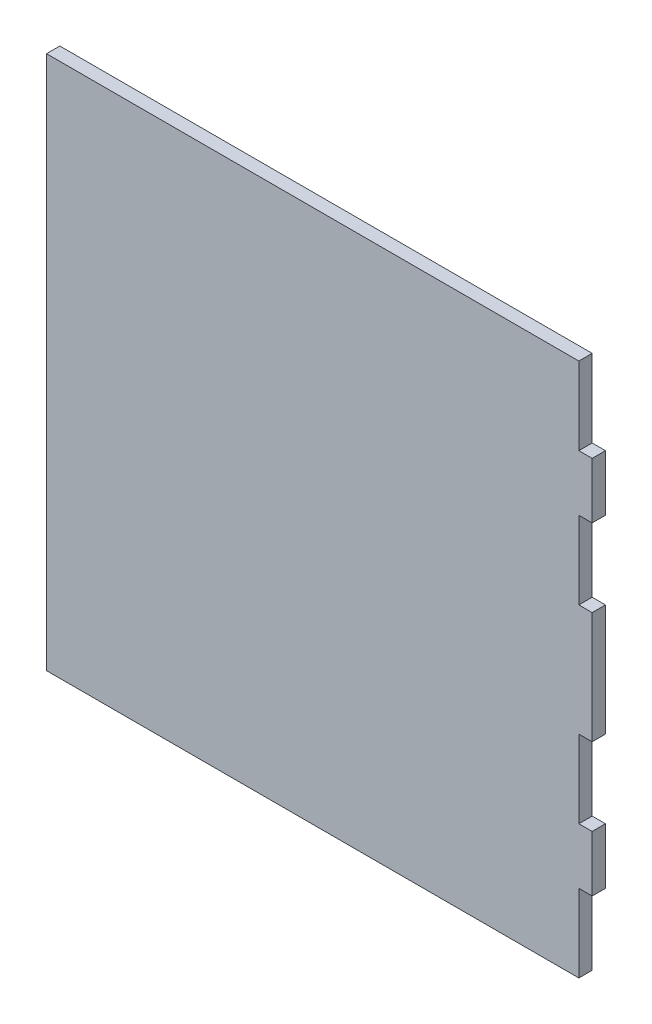
ISO-10303-21;
HEADER;
FILE_DESCRIPTION(('STEP AP214'),'2;1');
FILE_NAME('part.step','',(''),(''),'','','');
FILE_SCHEMA(('AUTOMOTIVE_DESIGN { 1 0 10303 214 1 1 1 1 }'));
ENDSEC;
DATA;
#1=APPLICATION_CONTEXT('core data for automotive mechanical design processes');
#2=APPLICATION_PROTOCOL_DEFINITION('international standard','automotive_design',2000,#1);
#3=PRODUCT_CONTEXT('',#1,'mechanical');
#4=PRODUCT('Part','Part','',(#3));
#5=PRODUCT_RELATED_PRODUCT_CATEGORY('part','',(#4));
#6=PRODUCT_DEFINITION_FORMATION('','',#4);
#7=PRODUCT_DEFINITION_CONTEXT('part definition',#1,'design');
#8=PRODUCT_DEFINITION('design','',#6,#7);
#9=PRODUCT_DEFINITION_SHAPE('','',#8);
#10=(LENGTH_UNIT() NAMED_UNIT(*) SI_UNIT(.MILLI.,.METRE.));
#11=(NAMED_UNIT(*) PLANE_ANGLE_UNIT() SI_UNIT($,.RADIAN.));
#12=(NAMED_UNIT(*) SI_UNIT($,.STERADIAN.) SOLID_ANGLE_UNIT());
#13=UNCERTAINTY_MEASURE_WITH_UNIT(LENGTH_MEASURE(1.E-05),#10,'distance_accuracy_value','');
#14=(GEOMETRIC_REPRESENTATION_CONTEXT(3) GLOBAL_UNCERTAINTY_ASSIGNED_CONTEXT((#13)) GLOBAL_UNIT_ASSIGNED_CONTEXT((#10,
#11,#12)) REPRESENTATION_CONTEXT('',''));
#15=CARTESIAN_POINT('',(0.,0.,0.));
#16=DIRECTION('',(0.,0.,1.));
#17=DIRECTION('',(1.,0.,0.));
#18=AXIS2_PLACEMENT_3D('',#15,#16,#17);
#19=CARTESIAN_POINT('',(-163.972610893126,-160.108528092475,6.));
#20=DIRECTION('',(-1.,0.,0.));
#21=DIRECTION('',(0.,0.,1.));
#22=AXIS2_PLACEMENT_3D('',#19,#20,#21);
#23=PLANE('',#22);
#24=DIRECTION('',(0.,1.,0.));
#25=VECTOR('',#24,1.);
#26=CARTESIAN_POINT('',(-163.972610893126,-160.108528092475,0.));
#27=LINE('',#26,#25);
#28=CARTESIAN_POINT('',(-163.972610893126,-195.108528092475,0.));
#29=VERTEX_POINT('',#28);
#30=CARTESIAN_POINT('',(-163.972610893126,-160.108528092475,0.));
#31=VERTEX_POINT('',#30);
#32=EDGE_CURVE('E188',#29,#31,#27,.T.);
#33=ORIENTED_EDGE('',*,*,#32,.T.);
#34=DIRECTION('',(0.,0.,-1.));
#35=VECTOR('',#34,1.);
#36=CARTESIAN_POINT('',(-163.972610893126,-160.108528092475,6.));
#37=LINE('',#36,#35);
#38=CARTESIAN_POINT('',(-163.972610893126,-160.108528092475,6.));
#39=VERTEX_POINT('',#38);
#40=EDGE_CURVE('E11',#39,#31,#37,.T.);
#41=ORIENTED_EDGE('',*,*,#40,.F.);
#42=DIRECTION('',(0.,1.,0.));
#43=VECTOR('',#42,1.);
#44=CARTESIAN_POINT('',(-163.972610893126,-160.108528092475,6.));
#45=LINE('',#44,#43);
#46=CARTESIAN_POINT('',(-163.972610893126,-195.108528092475,6.));
#47=VERTEX_POINT('',#46);
#48=EDGE_CURVE('E234',#47,#39,#45,.T.);
#49=ORIENTED_EDGE('',*,*,#48,.F.);
#50=DIRECTION('',(0.,0.,-1.));
#51=VECTOR('',#50,1.);
#52=CARTESIAN_POINT('',(-163.972610893126,-195.108528092475,6.));
#53=LINE('',#52,#51);
#54=EDGE_CURVE('E184',#47,#29,#53,.T.);
#55=ORIENTED_EDGE('',*,*,#54,.T.);
#56=EDGE_LOOP('',(#33,#41,#49,#55));
#57=FACE_BOUND('',#56,.T.);
#58=ADVANCED_FACE('F39',(#57),#23,.F.);
#59=CARTESIAN_POINT('',(-163.972610893126,-160.108528092475,6.));
#60=DIRECTION('',(0.,-1.,0.));
#61=DIRECTION('',(1.,0.,0.));
#62=AXIS2_PLACEMENT_3D('',#59,#60,#61);
#63=PLANE('',#62);
#64=DIRECTION('',(-1.,0.,0.));
#65=VECTOR('',#64,1.);
#66=CARTESIAN_POINT('',(-163.972610893126,-160.108528092475,0.));
#67=LINE('',#66,#65);
#68=CARTESIAN_POINT('',(-403.972610893126,-160.108528092475,0.));
#69=VERTEX_POINT('',#68);
#70=EDGE_CURVE('E192',#31,#69,#67,.T.);
#71=ORIENTED_EDGE('',*,*,#70,.T.);
#72=DIRECTION('',(0.,0.,-1.));
#73=VECTOR('',#72,1.);
#74=CARTESIAN_POINT('',(-403.972610893126,-160.108528092475,6.));
#75=LINE('',#74,#73);
#76=CARTESIAN_POINT('',(-403.972610893126,-160.108528092475,6.));
#77=VERTEX_POINT('',#76);
#78=EDGE_CURVE('E48',#77,#69,#75,.T.);
#79=ORIENTED_EDGE('',*,*,#78,.F.);
#80=DIRECTION('',(-1.,0.,0.));
#81=VECTOR('',#80,1.);
#82=CARTESIAN_POINT('',(-163.972610893126,-160.108528092475,6.));
#83=LINE('',#82,#81);
#84=EDGE_CURVE('E123',#39,#77,#83,.T.);
#85=ORIENTED_EDGE('',*,*,#84,.F.);
#86=ORIENTED_EDGE('',*,*,#40,.T.);
#87=EDGE_LOOP('',(#71,#79,#85,#86));
#88=FACE_BOUND('',#87,.T.);
#89=ADVANCED_FACE('F356',(#88),#63,.F.);
#90=CARTESIAN_POINT('',(-403.972610893126,-160.108528092475,6.));
#91=DIRECTION('',(1.,0.,0.));
#92=DIRECTION('',(0.,1.,0.));
#93=AXIS2_PLACEMENT_3D('',#90,#91,#92);
#94=PLANE('',#93);
#95=DIRECTION('',(0.,-1.,0.));
#96=VECTOR('',#95,1.);
#97=CARTESIAN_POINT('',(-403.972610893126,-160.108528092475,0.));
#98=LINE('',#97,#96);
#99=CARTESIAN_POINT('',(-403.972610893126,-401.007755411257,0.));
#100=VERTEX_POINT('',#99);
#101=EDGE_CURVE('E195',#69,#100,#98,.T.);
#102=ORIENTED_EDGE('',*,*,#101,.T.);
#103=DIRECTION('',(0.,0.,-1.));
#104=VECTOR('',#103,1.);
#105=CARTESIAN_POINT('',(-403.972610893126,-401.007755411257,6.));
#106=LINE('',#105,#104);
#107=CARTESIAN_POINT('',(-403.972610893126,-401.007755411257,6.));
#108=VERTEX_POINT('',#107);
#109=EDGE_CURVE('E277',#108,#100,#106,.T.);
#110=ORIENTED_EDGE('',*,*,#109,.F.);
#111=DIRECTION('',(0.,-1.,0.));
#112=VECTOR('',#111,1.);
#113=CARTESIAN_POINT('',(-403.972610893126,-160.108528092475,6.));
#114=LINE('',#113,#112);
#115=EDGE_CURVE('E287',#77,#108,#114,.T.);
#116=ORIENTED_EDGE('',*,*,#115,.F.);
#117=ORIENTED_EDGE('',*,*,#78,.T.);
#118=EDGE_LOOP('',(#102,#110,#116,#117));
#119=FACE_BOUND('',#118,.T.);
#120=ADVANCED_FACE('F285',(#119),#94,.F.);
#121=CARTESIAN_POINT('',(-163.972610893126,-401.007755411257,6.));
#122=DIRECTION('',(0.,1.,0.));
#123=DIRECTION('',(-1.,0.,0.));
#124=AXIS2_PLACEMENT_3D('',#121,#122,#123);
#125=PLANE('',#124);
#126=DIRECTION('',(1.,0.,0.));
#127=VECTOR('',#126,1.);
#128=CARTESIAN_POINT('',(-163.972610893126,-401.007755411257,0.));
#129=LINE('',#128,#127);
#130=CARTESIAN_POINT('',(-163.972610893126,-401.007755411257,0.));
#131=VERTEX_POINT('',#130);
#132=EDGE_CURVE('E198',#100,#131,#129,.T.);
#133=ORIENTED_EDGE('',*,*,#132,.T.);
#134=DIRECTION('',(0.,0.,-1.));
#135=VECTOR('',#134,1.);
#136=CARTESIAN_POINT('',(-163.972610893126,-401.007755411257,6.));
#137=LINE('',#136,#135);
#138=CARTESIAN_POINT('',(-163.972610893126,-401.007755411257,6.));
#139=VERTEX_POINT('',#138);
#140=EDGE_CURVE('E273',#139,#131,#137,.T.);
#141=ORIENTED_EDGE('',*,*,#140,.F.);
#142=DIRECTION('',(1.,0.,0.));
#143=VECTOR('',#142,1.);
#144=CARTESIAN_POINT('',(-163.972610893126,-401.007755411257,6.));
#145=LINE('',#144,#143);
#146=EDGE_CURVE('E306',#108,#139,#145,.T.);
#147=ORIENTED_EDGE('',*,*,#146,.F.);
#148=ORIENTED_EDGE('',*,*,#109,.T.);
#149=EDGE_LOOP('',(#133,#141,#147,#148));
#150=FACE_BOUND('',#149,.T.);
#151=ADVANCED_FACE('F296',(#150),#125,.F.);
#152=CARTESIAN_POINT('',(-163.972610893126,-366.007755411257,6.));
#153=DIRECTION('',(-1.,0.,0.));
#154=DIRECTION('',(0.,0.,1.));
#155=AXIS2_PLACEMENT_3D('',#152,#153,#154);
#156=PLANE('',#155);
#157=DIRECTION('',(0.,1.,0.));
#158=VECTOR('',#157,1.);
#159=CARTESIAN_POINT('',(-163.972610893126,-366.007755411257,0.));
#160=LINE('',#159,#158);
#161=CARTESIAN_POINT('',(-163.972610893126,-366.007755411257,0.));
#162=VERTEX_POINT('',#161);
#163=EDGE_CURVE('E201',#131,#162,#160,.T.);
#164=ORIENTED_EDGE('',*,*,#163,.T.);
#165=DIRECTION('',(0.,0.,-1.));
#166=VECTOR('',#165,1.);
#167=CARTESIAN_POINT('',(-163.972610893126,-366.007755411257,6.));
#168=LINE('',#167,#166);
#169=CARTESIAN_POINT('',(-163.972610893126,-366.007755411257,6.));
#170=VERTEX_POINT('',#169);
#171=EDGE_CURVE('E269',#170,#162,#168,.T.);
#172=ORIENTED_EDGE('',*,*,#171,.F.);
#173=DIRECTION('',(0.,1.,0.));
#174=VECTOR('',#173,1.);
#175=CARTESIAN_POINT('',(-163.972610893126,-366.007755411257,6.));
#176=LINE('',#175,#174);
#177=EDGE_CURVE('E302',#139,#170,#176,.T.);
#178=ORIENTED_EDGE('',*,*,#177,.F.);
#179=ORIENTED_EDGE('',*,*,#140,.T.);
#180=EDGE_LOOP('',(#164,#172,#178,#179));
#181=FACE_BOUND('',#180,.T.);
#182=ADVANCED_FACE('F300',(#181),#156,.F.);
#183=CARTESIAN_POINT('',(-163.972610893126,-366.007755411257,6.));
#184=DIRECTION('',(0.,1.,0.));
#185=DIRECTION('',(0.,0.,1.));
#186=AXIS2_PLACEMENT_3D('',#183,#184,#185);
#187=PLANE('',#186);
#188=DIRECTION('',(1.,0.,0.));
#189=VECTOR('',#188,1.);
#190=CARTESIAN_POINT('',(-163.972610893126,-366.007755411257,0.));
#191=LINE('',#190,#189);
#192=CARTESIAN_POINT('',(-157.972610893126,-366.007755411257,0.));
#193=VERTEX_POINT('',#192);
#194=EDGE_CURVE('E204',#162,#193,#191,.T.);
#195=ORIENTED_EDGE('',*,*,#194,.T.);
#196=DIRECTION('',(0.,0.,-1.));
#197=VECTOR('',#196,1.);
#198=CARTESIAN_POINT('',(-157.972610893126,-366.007755411257,6.));
#199=LINE('',#198,#197);
#200=CARTESIAN_POINT('',(-157.972610893126,-366.007755411257,6.));
#201=VERTEX_POINT('',#200);
#202=EDGE_CURVE('E265',#201,#193,#199,.T.);
#203=ORIENTED_EDGE('',*,*,#202,.F.);
#204=DIRECTION('',(1.,0.,0.));
#205=VECTOR('',#204,1.);
#206=CARTESIAN_POINT('',(-163.972610893126,-366.007755411257,6.));
#207=LINE('',#206,#205);
#208=EDGE_CURVE('E305',#170,#201,#207,.T.);
#209=ORIENTED_EDGE('',*,*,#208,.F.);
#210=ORIENTED_EDGE('',*,*,#171,.T.);
#211=EDGE_LOOP('',(#195,#203,#209,#210));
#212=FACE_BOUND('',#211,.T.);
#213=ADVANCED_FACE('F369',(#212),#187,.F.);
#214=CARTESIAN_POINT('',(-157.972610893126,-340.782948581561,6.));
#215=DIRECTION('',(-1.,0.,0.));
#216=DIRECTION('',(0.,0.,1.));
#217=AXIS2_PLACEMENT_3D('',#214,#215,#216);
#218=PLANE('',#217);
#219=DIRECTION('',(0.,1.,0.));
#220=VECTOR('',#219,1.);
#221=CARTESIAN_POINT('',(-157.972610893126,-340.782948581561,0.));
#222=LINE('',#221,#220);
#223=CARTESIAN_POINT('',(-157.972610893126,-340.782948581561,0.));
#224=VERTEX_POINT('',#223);
#225=EDGE_CURVE('E207',#193,#224,#222,.T.);
#226=ORIENTED_EDGE('',*,*,#225,.T.);
#227=DIRECTION('',(0.,0.,-1.));
#228=VECTOR('',#227,1.);
#229=CARTESIAN_POINT('',(-157.972610893126,-340.782948581561,6.));
#230=LINE('',#229,#228);
#231=CARTESIAN_POINT('',(-157.972610893126,-340.782948581561,6.));
#232=VERTEX_POINT('',#231);
#233=EDGE_CURVE('E261',#232,#224,#230,.T.);
#234=ORIENTED_EDGE('',*,*,#233,.F.);
#235=DIRECTION('',(0.,1.,0.));
#236=VECTOR('',#235,1.);
#237=CARTESIAN_POINT('',(-157.972610893126,-340.782948581561,6.));
#238=LINE('',#237,#236);
#239=EDGE_CURVE('E310',#201,#232,#238,.T.);
#240=ORIENTED_EDGE('',*,*,#239,.F.);
#241=ORIENTED_EDGE('',*,*,#202,.T.);
#242=EDGE_LOOP('',(#226,#234,#240,#241));
#243=FACE_BOUND('',#242,.T.);
#244=ADVANCED_FACE('F372',(#243),#218,.F.);
#245=CARTESIAN_POINT('',(-163.972610893126,-340.782948581561,6.));
#246=DIRECTION('',(0.,-1.,0.));
#247=DIRECTION('',(0.,0.,-1.));
#248=AXIS2_PLACEMENT_3D('',#245,#246,#247);
#249=PLANE('',#248);
#250=DIRECTION('',(-1.,0.,0.));
#251=VECTOR('',#250,1.);
#252=CARTESIAN_POINT('',(-163.972610893126,-340.782948581561,0.));
#253=LINE('',#252,#251);
#254=CARTESIAN_POINT('',(-163.972610893126,-340.782948581561,0.));
#255=VERTEX_POINT('',#254);
#256=EDGE_CURVE('E210',#224,#255,#253,.T.);
#257=ORIENTED_EDGE('',*,*,#256,.T.);
#258=DIRECTION('',(0.,0.,-1.));
#259=VECTOR('',#258,1.);
#260=CARTESIAN_POINT('',(-163.972610893126,-340.782948581561,6.));
#261=LINE('',#260,#259);
#262=CARTESIAN_POINT('',(-163.972610893126,-340.782948581561,6.));
#263=VERTEX_POINT('',#262);
#264=EDGE_CURVE('E257',#263,#255,#261,.T.);
#265=ORIENTED_EDGE('',*,*,#264,.F.);
#266=DIRECTION('',(-1.,0.,0.));
#267=VECTOR('',#266,1.);
#268=CARTESIAN_POINT('',(-163.972610893126,-340.782948581561,6.));
#269=LINE('',#268,#267);
#270=EDGE_CURVE('E317',#232,#263,#269,.T.);
#271=ORIENTED_EDGE('',*,*,#270,.F.);
#272=ORIENTED_EDGE('',*,*,#233,.T.);
#273=EDGE_LOOP('',(#257,#265,#271,#272));
#274=FACE_BOUND('',#273,.T.);
#275=ADVANCED_FACE('F376',(#274),#249,.F.);
#276=CARTESIAN_POINT('',(-163.972610893126,-305.782948581561,6.));
#277=DIRECTION('',(-1.,0.,0.));
#278=DIRECTION('',(0.,0.,1.));
#279=AXIS2_PLACEMENT_3D('',#276,#277,#278);
#280=PLANE('',#279);
#281=DIRECTION('',(0.,1.,0.));
#282=VECTOR('',#281,1.);
#283=CARTESIAN_POINT('',(-163.972610893126,-305.782948581561,0.));
#284=LINE('',#283,#282);
#285=CARTESIAN_POINT('',(-163.972610893126,-305.782948581561,0.));
#286=VERTEX_POINT('',#285);
#287=EDGE_CURVE('E213',#255,#286,#284,.T.);
#288=ORIENTED_EDGE('',*,*,#287,.T.);
#289=DIRECTION('',(0.,0.,-1.));
#290=VECTOR('',#289,1.);
#291=CARTESIAN_POINT('',(-163.972610893126,-305.782948581561,6.));
#292=LINE('',#291,#290);
#293=CARTESIAN_POINT('',(-163.972610893126,-305.782948581561,6.));
#294=VERTEX_POINT('',#293);
#295=EDGE_CURVE('E253',#294,#286,#292,.T.);
#296=ORIENTED_EDGE('',*,*,#295,.F.);
#297=DIRECTION('',(0.,1.,0.));
#298=VECTOR('',#297,1.);
#299=CARTESIAN_POINT('',(-163.972610893126,-305.782948581561,6.));
#300=LINE('',#299,#298);
#301=EDGE_CURVE('E320',#263,#294,#300,.T.);
#302=ORIENTED_EDGE('',*,*,#301,.F.);
#303=ORIENTED_EDGE('',*,*,#264,.T.);
#304=EDGE_LOOP('',(#288,#296,#302,#303));
#305=FACE_BOUND('',#304,.T.);
#306=ADVANCED_FACE('F380',(#305),#280,.F.);
#307=CARTESIAN_POINT('',(-163.972610893126,-305.782948581561,6.));
#308=DIRECTION('',(0.,1.,0.));
#309=DIRECTION('',(0.,0.,1.));
#310=AXIS2_PLACEMENT_3D('',#307,#308,#309);
#311=PLANE('',#310);
#312=DIRECTION('',(1.,0.,0.));
#313=VECTOR('',#312,1.);
#314=CARTESIAN_POINT('',(-163.972610893126,-305.782948581561,0.));
#315=LINE('',#314,#313);
#316=CARTESIAN_POINT('',(-157.972610893126,-305.782948581561,0.));
#317=VERTEX_POINT('',#316);
#318=EDGE_CURVE('E216',#286,#317,#315,.T.);
#319=ORIENTED_EDGE('',*,*,#318,.T.);
#320=DIRECTION('',(0.,0.,-1.));
#321=VECTOR('',#320,1.);
#322=CARTESIAN_POINT('',(-157.972610893126,-305.782948581561,6.));
#323=LINE('',#322,#321);
#324=CARTESIAN_POINT('',(-157.972610893126,-305.782948581561,6.));
#325=VERTEX_POINT('',#324);
#326=EDGE_CURVE('E249',#325,#317,#323,.T.);
#327=ORIENTED_EDGE('',*,*,#326,.F.);
#328=DIRECTION('',(1.,0.,0.));
#329=VECTOR('',#328,1.);
#330=CARTESIAN_POINT('',(-163.972610893126,-305.782948581561,6.));
#331=LINE('',#330,#329);
#332=EDGE_CURVE('E323',#294,#325,#331,.T.);
#333=ORIENTED_EDGE('',*,*,#332,.F.);
#334=ORIENTED_EDGE('',*,*,#295,.T.);
#335=EDGE_LOOP('',(#319,#327,#333,#334));
#336=FACE_BOUND('',#335,.T.);
#337=ADVANCED_FACE('F384',(#336),#311,.F.);
#338=CARTESIAN_POINT('',(-157.972610893126,-255.333334922171,6.));
#339=DIRECTION('',(-1.,0.,0.));
#340=DIRECTION('',(0.,0.,1.));
#341=AXIS2_PLACEMENT_3D('',#338,#339,#340);
#342=PLANE('',#341);
#343=DIRECTION('',(0.,1.,0.));
#344=VECTOR('',#343,1.);
#345=CARTESIAN_POINT('',(-157.972610893126,-255.333334922171,0.));
#346=LINE('',#345,#344);
#347=CARTESIAN_POINT('',(-157.972610893126,-255.333334922171,0.));
#348=VERTEX_POINT('',#347);
#349=EDGE_CURVE('E219',#317,#348,#346,.T.);
#350=ORIENTED_EDGE('',*,*,#349,.T.);
#351=DIRECTION('',(0.,0.,-1.));
#352=VECTOR('',#351,1.);
#353=CARTESIAN_POINT('',(-157.972610893126,-255.333334922171,6.));
#354=LINE('',#353,#352);
#355=CARTESIAN_POINT('',(-157.972610893126,-255.333334922171,6.));
#356=VERTEX_POINT('',#355);
#357=EDGE_CURVE('E245',#356,#348,#354,.T.);
#358=ORIENTED_EDGE('',*,*,#357,.F.);
#359=DIRECTION('',(0.,1.,0.));
#360=VECTOR('',#359,1.);
#361=CARTESIAN_POINT('',(-157.972610893126,-255.333334922171,6.));
#362=LINE('',#361,#360);
#363=EDGE_CURVE('E326',#325,#356,#362,.T.);
#364=ORIENTED_EDGE('',*,*,#363,.F.);
#365=ORIENTED_EDGE('',*,*,#326,.T.);
#366=EDGE_LOOP('',(#350,#358,#364,#365));
#367=FACE_BOUND('',#366,.T.);
#368=ADVANCED_FACE('F388',(#367),#342,.F.);
#369=CARTESIAN_POINT('',(-163.972610893126,-255.333334922171,6.));
#370=DIRECTION('',(0.,-1.,0.));
#371=DIRECTION('',(0.,0.,-1.));
#372=AXIS2_PLACEMENT_3D('',#369,#370,#371);
#373=PLANE('',#372);
#374=DIRECTION('',(-1.,0.,0.));
#375=VECTOR('',#374,1.);
#376=CARTESIAN_POINT('',(-163.972610893126,-255.333334922171,0.));
#377=LINE('',#376,#375);
#378=CARTESIAN_POINT('',(-163.972610893126,-255.333334922171,0.));
#379=VERTEX_POINT('',#378);
#380=EDGE_CURVE('E222',#348,#379,#377,.T.);
#381=ORIENTED_EDGE('',*,*,#380,.T.);
#382=DIRECTION('',(0.,0.,-1.));
#383=VECTOR('',#382,1.);
#384=CARTESIAN_POINT('',(-163.972610893126,-255.333334922171,6.));
#385=LINE('',#384,#383);
#386=CARTESIAN_POINT('',(-163.972610893126,-255.333334922171,6.));
#387=VERTEX_POINT('',#386);
#388=EDGE_CURVE('E241',#387,#379,#385,.T.);
#389=ORIENTED_EDGE('',*,*,#388,.F.);
#390=DIRECTION('',(-1.,0.,0.));
#391=VECTOR('',#390,1.);
#392=CARTESIAN_POINT('',(-163.972610893126,-255.333334922171,6.));
#393=LINE('',#392,#391);
#394=EDGE_CURVE('E329',#356,#387,#393,.T.);
#395=ORIENTED_EDGE('',*,*,#394,.F.);
#396=ORIENTED_EDGE('',*,*,#357,.T.);
#397=EDGE_LOOP('',(#381,#389,#395,#396));
#398=FACE_BOUND('',#397,.T.);
#399=ADVANCED_FACE('F337',(#398),#373,.F.);
#400=CARTESIAN_POINT('',(-163.972610893126,-220.333334922171,6.));
#401=DIRECTION('',(-1.,0.,0.));
#402=DIRECTION('',(0.,0.,1.));
#403=AXIS2_PLACEMENT_3D('',#400,#401,#402);
#404=PLANE('',#403);
#405=DIRECTION('',(0.,1.,0.));
#406=VECTOR('',#405,1.);
#407=CARTESIAN_POINT('',(-163.972610893126,-220.333334922171,0.));
#408=LINE('',#407,#406);
#409=CARTESIAN_POINT('',(-163.972610893126,-220.333334922171,0.));
#410=VERTEX_POINT('',#409);
#411=EDGE_CURVE('E225',#379,#410,#408,.T.);
#412=ORIENTED_EDGE('',*,*,#411,.T.);
#413=DIRECTION('',(0.,0.,-1.));
#414=VECTOR('',#413,1.);
#415=CARTESIAN_POINT('',(-163.972610893126,-220.333334922171,6.));
#416=LINE('',#415,#414);
#417=CARTESIAN_POINT('',(-163.972610893126,-220.333334922171,6.));
#418=VERTEX_POINT('',#417);
#419=EDGE_CURVE('E177',#418,#410,#416,.T.);
#420=ORIENTED_EDGE('',*,*,#419,.F.);
#421=DIRECTION('',(0.,1.,0.));
#422=VECTOR('',#421,1.);
#423=CARTESIAN_POINT('',(-163.972610893126,-220.333334922171,6.));
#424=LINE('',#423,#422);
#425=EDGE_CURVE('E166',#387,#418,#424,.T.);
#426=ORIENTED_EDGE('',*,*,#425,.F.);
#427=ORIENTED_EDGE('',*,*,#388,.T.);
#428=EDGE_LOOP('',(#412,#420,#426,#427));
#429=FACE_BOUND('',#428,.T.);
#430=ADVANCED_FACE('F341',(#429),#404,.F.);
#431=CARTESIAN_POINT('',(-163.972610893126,-220.333334922171,6.));
#432=DIRECTION('',(0.,1.,0.));
#433=DIRECTION('',(0.,0.,1.));
#434=AXIS2_PLACEMENT_3D('',#431,#432,#433);
#435=PLANE('',#434);
#436=DIRECTION('',(1.,0.,0.));
#437=VECTOR('',#436,1.);
#438=CARTESIAN_POINT('',(-163.972610893126,-220.333334922171,0.));
#439=LINE('',#438,#437);
#440=CARTESIAN_POINT('',(-157.972610893126,-220.333334922171,0.));
#441=VERTEX_POINT('',#440);
#442=EDGE_CURVE('E175',#410,#441,#439,.T.);
#443=ORIENTED_EDGE('',*,*,#442,.T.);
#444=DIRECTION('',(0.,0.,-1.));
#445=VECTOR('',#444,1.);
#446=CARTESIAN_POINT('',(-157.972610893126,-220.333334922171,6.));
#447=LINE('',#446,#445);
#448=CARTESIAN_POINT('',(-157.972610893126,-220.333334922171,6.));
#449=VERTEX_POINT('',#448);
#450=EDGE_CURVE('E172',#449,#441,#447,.T.);
#451=ORIENTED_EDGE('',*,*,#450,.F.);
#452=DIRECTION('',(1.,0.,0.));
#453=VECTOR('',#452,1.);
#454=CARTESIAN_POINT('',(-163.972610893126,-220.333334922171,6.));
#455=LINE('',#454,#453);
#456=EDGE_CURVE('E160',#418,#449,#455,.T.);
#457=ORIENTED_EDGE('',*,*,#456,.F.);
#458=ORIENTED_EDGE('',*,*,#419,.T.);
#459=EDGE_LOOP('',(#443,#451,#457,#458));
#460=FACE_BOUND('',#459,.T.);
#461=ADVANCED_FACE('F173',(#460),#435,.F.);
#462=CARTESIAN_POINT('',(-157.972610893126,-195.108528092475,6.));
#463=DIRECTION('',(-1.,0.,0.));
#464=DIRECTION('',(0.,0.,1.));
#465=AXIS2_PLACEMENT_3D('',#462,#463,#464);
#466=PLANE('',#465);
#467=DIRECTION('',(0.,1.,0.));
#468=VECTOR('',#467,1.);
#469=CARTESIAN_POINT('',(-157.972610893126,-195.108528092475,0.));
#470=LINE('',#469,#468);
#471=CARTESIAN_POINT('',(-157.972610893126,-195.108528092475,0.));
#472=VERTEX_POINT('',#471);
#473=EDGE_CURVE('E109',#441,#472,#470,.T.);
#474=ORIENTED_EDGE('',*,*,#473,.T.);
#475=DIRECTION('',(0.,0.,-1.));
#476=VECTOR('',#475,1.);
#477=CARTESIAN_POINT('',(-157.972610893126,-195.108528092475,6.));
#478=LINE('',#477,#476);
#479=CARTESIAN_POINT('',(-157.972610893126,-195.108528092475,6.));
#480=VERTEX_POINT('',#479);
#481=EDGE_CURVE('E178',#480,#472,#478,.T.);
#482=ORIENTED_EDGE('',*,*,#481,.F.);
#483=DIRECTION('',(0.,1.,0.));
#484=VECTOR('',#483,1.);
#485=CARTESIAN_POINT('',(-157.972610893126,-195.108528092475,6.));
#486=LINE('',#485,#484);
#487=EDGE_CURVE('E164',#449,#480,#486,.T.);
#488=ORIENTED_EDGE('',*,*,#487,.F.);
#489=ORIENTED_EDGE('',*,*,#450,.T.);
#490=EDGE_LOOP('',(#474,#482,#488,#489));
#491=FACE_BOUND('',#490,.T.);
#492=ADVANCED_FACE('F180',(#491),#466,.F.);
#493=CARTESIAN_POINT('',(-163.972610893126,-195.108528092475,6.));
#494=DIRECTION('',(0.,-1.,0.));
#495=DIRECTION('',(0.,0.,-1.));
#496=AXIS2_PLACEMENT_3D('',#493,#494,#495);
#497=PLANE('',#496);
#498=DIRECTION('',(-1.,0.,0.));
#499=VECTOR('',#498,1.);
#500=CARTESIAN_POINT('',(-163.972610893126,-195.108528092475,0.));
#501=LINE('',#500,#499);
#502=EDGE_CURVE('E115',#472,#29,#501,.T.);
#503=ORIENTED_EDGE('',*,*,#502,.T.);
#504=ORIENTED_EDGE('',*,*,#54,.F.);
#505=DIRECTION('',(-1.,0.,0.));
#506=VECTOR('',#505,1.);
#507=CARTESIAN_POINT('',(-163.972610893126,-195.108528092475,6.));
#508=LINE('',#507,#506);
#509=EDGE_CURVE('E56',#480,#47,#508,.T.);
#510=ORIENTED_EDGE('',*,*,#509,.F.);
#511=ORIENTED_EDGE('',*,*,#481,.T.);
#512=EDGE_LOOP('',(#503,#504,#510,#511));
#513=FACE_BOUND('',#512,.T.);
#514=ADVANCED_FACE('F345',(#513),#497,.F.);
#515=CARTESIAN_POINT('',(0.,0.,6.));
#516=DIRECTION('',(0.,0.,1.));
#517=DIRECTION('',(1.,0.,0.));
#518=AXIS2_PLACEMENT_3D('',#515,#516,#517);
#519=PLANE('',#518);
#520=ORIENTED_EDGE('',*,*,#48,.T.);
#521=ORIENTED_EDGE('',*,*,#84,.T.);
#522=ORIENTED_EDGE('',*,*,#115,.T.);
#523=ORIENTED_EDGE('',*,*,#146,.T.);
#524=ORIENTED_EDGE('',*,*,#177,.T.);
#525=ORIENTED_EDGE('',*,*,#208,.T.);
#526=ORIENTED_EDGE('',*,*,#239,.T.);
#527=ORIENTED_EDGE('',*,*,#270,.T.);
#528=ORIENTED_EDGE('',*,*,#301,.T.);
#529=ORIENTED_EDGE('',*,*,#332,.T.);
#530=ORIENTED_EDGE('',*,*,#363,.T.);
#531=ORIENTED_EDGE('',*,*,#394,.T.);
#532=ORIENTED_EDGE('',*,*,#425,.T.);
#533=ORIENTED_EDGE('',*,*,#456,.T.);
#534=ORIENTED_EDGE('',*,*,#487,.T.);
#535=ORIENTED_EDGE('',*,*,#509,.T.);
#536=EDGE_LOOP('',(#520,#521,#522,#523,#524,#525,#526,#527,#528,#529,#530,#531,#532,#533,#534,#535));
#537=FACE_BOUND('',#536,.T.);
#538=ADVANCED_FACE('F162',(#537),#519,.T.);
#539=CARTESIAN_POINT('',(0.,0.,0.));
#540=DIRECTION('',(0.,0.,1.));
#541=DIRECTION('',(1.,0.,0.));
#542=AXIS2_PLACEMENT_3D('',#539,#540,#541);
#543=PLANE('',#542);
#544=ORIENTED_EDGE('',*,*,#32,.F.);
#545=ORIENTED_EDGE('',*,*,#502,.F.);
#546=ORIENTED_EDGE('',*,*,#473,.F.);
#547=ORIENTED_EDGE('',*,*,#442,.F.);
#548=ORIENTED_EDGE('',*,*,#411,.F.);
#549=ORIENTED_EDGE('',*,*,#380,.F.);
#550=ORIENTED_EDGE('',*,*,#349,.F.);
#551=ORIENTED_EDGE('',*,*,#318,.F.);
#552=ORIENTED_EDGE('',*,*,#287,.F.);
#553=ORIENTED_EDGE('',*,*,#256,.F.);
#554=ORIENTED_EDGE('',*,*,#225,.F.);
#555=ORIENTED_EDGE('',*,*,#194,.F.);
#556=ORIENTED_EDGE('',*,*,#163,.F.);
#557=ORIENTED_EDGE('',*,*,#132,.F.);
#558=ORIENTED_EDGE('',*,*,#101,.F.);
#559=ORIENTED_EDGE('',*,*,#70,.F.);
#560=EDGE_LOOP('',(#544,#545,#546,#547,#548,#549,#550,#551,#552,#553,#554,#555,#556,#557,#558,#559));
#561=FACE_BOUND('',#560,.T.);
#562=ADVANCED_FACE('F291',(#561),#543,.F.);
#563=CLOSED_SHELL('',(#58,#89,#120,#151,#182,#213,#244,#275,#306,#337,#368,#399,#430,#461,#492,
#514,#538,#562));
#564=MANIFOLD_SOLID_BREP('B2',#563);
#565=ADVANCED_BREP_SHAPE_REPRESENTATION('',(#18,#564),#14);
#566=SHAPE_DEFINITION_REPRESENTATION(#9,#565);
ENDSEC;
END-ISO-10303-21;
